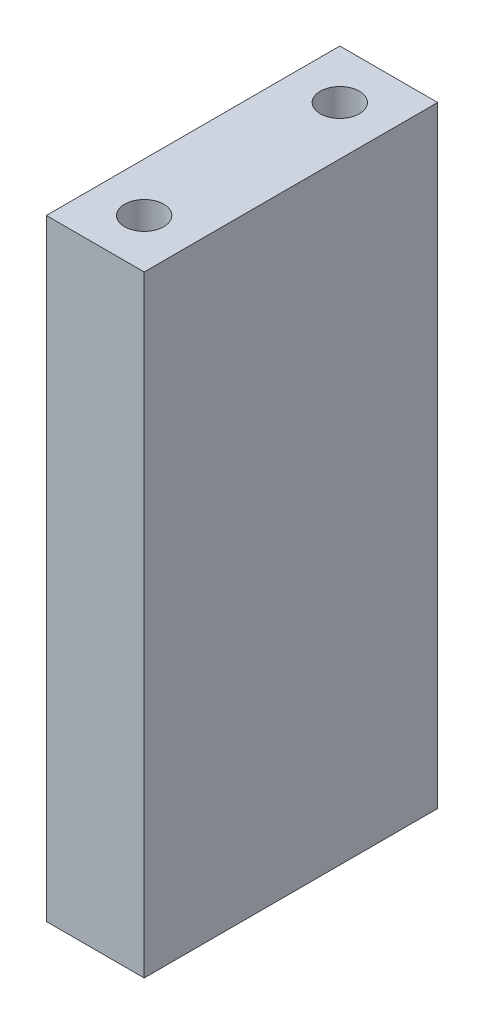
ISO-10303-21;
HEADER;
FILE_DESCRIPTION(('STEP AP214'),'2;1');
FILE_NAME('part.step','',(''),(''),'','','');
FILE_SCHEMA(('AUTOMOTIVE_DESIGN { 1 0 10303 214 1 1 1 1 }'));
ENDSEC;
DATA;
#1=APPLICATION_CONTEXT('core data for automotive mechanical design processes');
#2=APPLICATION_PROTOCOL_DEFINITION('international standard','automotive_design',2000,#1);
#3=PRODUCT_CONTEXT('',#1,'mechanical');
#4=PRODUCT('Part','Part','',(#3));
#5=PRODUCT_RELATED_PRODUCT_CATEGORY('part','',(#4));
#6=PRODUCT_DEFINITION_FORMATION('','',#4);
#7=PRODUCT_DEFINITION_CONTEXT('part definition',#1,'design');
#8=PRODUCT_DEFINITION('design','',#6,#7);
#9=PRODUCT_DEFINITION_SHAPE('','',#8);
#10=(LENGTH_UNIT() NAMED_UNIT(*) SI_UNIT(.MILLI.,.METRE.));
#11=(NAMED_UNIT(*) PLANE_ANGLE_UNIT() SI_UNIT($,.RADIAN.));
#12=(NAMED_UNIT(*) SI_UNIT($,.STERADIAN.) SOLID_ANGLE_UNIT());
#13=UNCERTAINTY_MEASURE_WITH_UNIT(LENGTH_MEASURE(1.E-05),#10,'distance_accuracy_value','');
#14=(GEOMETRIC_REPRESENTATION_CONTEXT(3) GLOBAL_UNCERTAINTY_ASSIGNED_CONTEXT((#13)) GLOBAL_UNIT_ASSIGNED_CONTEXT((#10,
#11,#12)) REPRESENTATION_CONTEXT('',''));
#15=CARTESIAN_POINT('',(0.,0.,0.));
#16=DIRECTION('',(0.,0.,1.));
#17=DIRECTION('',(1.,0.,0.));
#18=AXIS2_PLACEMENT_3D('',#15,#16,#17);
#19=CARTESIAN_POINT('',(20.,62.5,-30.));
#20=DIRECTION('',(0.,0.,1.));
#21=DIRECTION('',(0.,-1.,0.));
#22=AXIS2_PLACEMENT_3D('',#19,#20,#21);
#23=PLANE('',#22);
#24=DIRECTION('',(0.,1.,0.));
#25=VECTOR('',#24,1.);
#26=CARTESIAN_POINT('',(0.,62.5,-30.));
#27=LINE('',#26,#25);
#28=CARTESIAN_POINT('',(0.,-62.5,-30.));
#29=VERTEX_POINT('',#28);
#30=CARTESIAN_POINT('',(0.,62.5,-30.));
#31=VERTEX_POINT('',#30);
#32=EDGE_CURVE('E95',#29,#31,#27,.T.);
#33=ORIENTED_EDGE('',*,*,#32,.T.);
#34=DIRECTION('',(-1.,0.,0.));
#35=VECTOR('',#34,1.);
#36=CARTESIAN_POINT('',(20.,62.5,-30.));
#37=LINE('',#36,#35);
#38=CARTESIAN_POINT('',(20.,62.5,-30.));
#39=VERTEX_POINT('',#38);
#40=EDGE_CURVE('E11',#39,#31,#37,.T.);
#41=ORIENTED_EDGE('',*,*,#40,.F.);
#42=DIRECTION('',(0.,1.,0.));
#43=VECTOR('',#42,1.);
#44=CARTESIAN_POINT('',(20.,62.5,-30.));
#45=LINE('',#44,#43);
#46=CARTESIAN_POINT('',(20.,-62.5,-30.));
#47=VERTEX_POINT('',#46);
#48=EDGE_CURVE('E83',#47,#39,#45,.T.);
#49=ORIENTED_EDGE('',*,*,#48,.F.);
#50=DIRECTION('',(-1.,0.,0.));
#51=VECTOR('',#50,1.);
#52=CARTESIAN_POINT('',(20.,-62.5,-30.));
#53=LINE('',#52,#51);
#54=EDGE_CURVE('E91',#47,#29,#53,.T.);
#55=ORIENTED_EDGE('',*,*,#54,.T.);
#56=EDGE_LOOP('',(#33,#41,#49,#55));
#57=FACE_BOUND('',#56,.T.);
#58=ADVANCED_FACE('F32',(#57),#23,.F.);
#59=CARTESIAN_POINT('',(20.,62.5,30.));
#60=DIRECTION('',(0.,-1.,0.));
#61=DIRECTION('',(0.,0.,-1.));
#62=AXIS2_PLACEMENT_3D('',#59,#60,#61);
#63=PLANE('',#62);
#64=CARTESIAN_POINT('',(10.,62.5,20.));
#65=DIRECTION('',(0.,1.,0.));
#66=DIRECTION('',(0.,0.,1.));
#67=AXIS2_PLACEMENT_3D('',#64,#65,#66);
#68=CIRCLE('',#67,4.);
#69=CARTESIAN_POINT('',(10.,62.5,24.));
#70=VERTEX_POINT('',#69);
#71=EDGE_CURVE('E115',#70,#70,#68,.T.);
#72=ORIENTED_EDGE('',*,*,#71,.F.);
#73=EDGE_LOOP('',(#72));
#74=FACE_BOUND('',#73,.T.);
#75=CARTESIAN_POINT('',(10.,62.5,-20.));
#76=DIRECTION('',(0.,1.,0.));
#77=DIRECTION('',(0.,0.,1.));
#78=AXIS2_PLACEMENT_3D('',#75,#76,#77);
#79=CIRCLE('',#78,4.);
#80=CARTESIAN_POINT('',(10.,62.5,-16.));
#81=VERTEX_POINT('',#80);
#82=EDGE_CURVE('E109',#81,#81,#79,.T.);
#83=ORIENTED_EDGE('',*,*,#82,.F.);
#84=EDGE_LOOP('',(#83));
#85=FACE_BOUND('',#84,.T.);
#86=DIRECTION('',(0.,0.,1.));
#87=VECTOR('',#86,1.);
#88=CARTESIAN_POINT('',(0.,62.5,30.));
#89=LINE('',#88,#87);
#90=CARTESIAN_POINT('',(0.,62.5,30.));
#91=VERTEX_POINT('',#90);
#92=EDGE_CURVE('E87',#31,#91,#89,.T.);
#93=ORIENTED_EDGE('',*,*,#92,.T.);
#94=DIRECTION('',(-1.,0.,0.));
#95=VECTOR('',#94,1.);
#96=CARTESIAN_POINT('',(20.,62.5,30.));
#97=LINE('',#96,#95);
#98=CARTESIAN_POINT('',(20.,62.5,30.));
#99=VERTEX_POINT('',#98);
#100=EDGE_CURVE('E40',#99,#91,#97,.T.);
#101=ORIENTED_EDGE('',*,*,#100,.F.);
#102=DIRECTION('',(0.,0.,1.));
#103=VECTOR('',#102,1.);
#104=CARTESIAN_POINT('',(20.,62.5,30.));
#105=LINE('',#104,#103);
#106=EDGE_CURVE('E78',#39,#99,#105,.T.);
#107=ORIENTED_EDGE('',*,*,#106,.F.);
#108=ORIENTED_EDGE('',*,*,#40,.T.);
#109=EDGE_LOOP('',(#93,#101,#107,#108));
#110=FACE_BOUND('',#109,.T.);
#111=ADVANCED_FACE('F86',(#74,#85,#110),#63,.F.);
#112=CARTESIAN_POINT('',(20.,62.5,30.));
#113=DIRECTION('',(0.,0.,-1.));
#114=DIRECTION('',(0.,1.,0.));
#115=AXIS2_PLACEMENT_3D('',#112,#113,#114);
#116=PLANE('',#115);
#117=DIRECTION('',(0.,-1.,0.));
#118=VECTOR('',#117,1.);
#119=CARTESIAN_POINT('',(0.,62.5,30.));
#120=LINE('',#119,#118);
#121=CARTESIAN_POINT('',(0.,-62.5,30.));
#122=VERTEX_POINT('',#121);
#123=EDGE_CURVE('E65',#91,#122,#120,.T.);
#124=ORIENTED_EDGE('',*,*,#123,.T.);
#125=DIRECTION('',(-1.,0.,0.));
#126=VECTOR('',#125,1.);
#127=CARTESIAN_POINT('',(20.,-62.5,30.));
#128=LINE('',#127,#126);
#129=CARTESIAN_POINT('',(20.,-62.5,30.));
#130=VERTEX_POINT('',#129);
#131=EDGE_CURVE('E88',#130,#122,#128,.T.);
#132=ORIENTED_EDGE('',*,*,#131,.F.);
#133=DIRECTION('',(0.,-1.,0.));
#134=VECTOR('',#133,1.);
#135=CARTESIAN_POINT('',(20.,62.5,30.));
#136=LINE('',#135,#134);
#137=EDGE_CURVE('E81',#99,#130,#136,.T.);
#138=ORIENTED_EDGE('',*,*,#137,.F.);
#139=ORIENTED_EDGE('',*,*,#100,.T.);
#140=EDGE_LOOP('',(#124,#132,#138,#139));
#141=FACE_BOUND('',#140,.T.);
#142=ADVANCED_FACE('F89',(#141),#116,.F.);
#143=CARTESIAN_POINT('',(20.,-62.5,30.));
#144=DIRECTION('',(0.,1.,0.));
#145=DIRECTION('',(0.,0.,1.));
#146=AXIS2_PLACEMENT_3D('',#143,#144,#145);
#147=PLANE('',#146);
#148=CARTESIAN_POINT('',(10.,-62.5,-20.));
#149=DIRECTION('',(0.,-1.,0.));
#150=DIRECTION('',(0.,0.,-1.));
#151=AXIS2_PLACEMENT_3D('',#148,#149,#150);
#152=CIRCLE('',#151,4.);
#153=CARTESIAN_POINT('',(10.,-62.5,-24.));
#154=VERTEX_POINT('',#153);
#155=EDGE_CURVE('E127',#154,#154,#152,.T.);
#156=ORIENTED_EDGE('',*,*,#155,.F.);
#157=EDGE_LOOP('',(#156));
#158=FACE_BOUND('',#157,.T.);
#159=CARTESIAN_POINT('',(10.,-62.5,20.));
#160=DIRECTION('',(0.,-1.,0.));
#161=DIRECTION('',(0.,0.,-1.));
#162=AXIS2_PLACEMENT_3D('',#159,#160,#161);
#163=CIRCLE('',#162,4.);
#164=CARTESIAN_POINT('',(10.,-62.5,16.));
#165=VERTEX_POINT('',#164);
#166=EDGE_CURVE('E121',#165,#165,#163,.T.);
#167=ORIENTED_EDGE('',*,*,#166,.F.);
#168=EDGE_LOOP('',(#167));
#169=FACE_BOUND('',#168,.T.);
#170=DIRECTION('',(0.,0.,-1.));
#171=VECTOR('',#170,1.);
#172=CARTESIAN_POINT('',(0.,-62.5,30.));
#173=LINE('',#172,#171);
#174=EDGE_CURVE('E71',#122,#29,#173,.T.);
#175=ORIENTED_EDGE('',*,*,#174,.T.);
#176=ORIENTED_EDGE('',*,*,#54,.F.);
#177=DIRECTION('',(0.,0.,-1.));
#178=VECTOR('',#177,1.);
#179=CARTESIAN_POINT('',(20.,-62.5,30.));
#180=LINE('',#179,#178);
#181=EDGE_CURVE('E48',#130,#47,#180,.T.);
#182=ORIENTED_EDGE('',*,*,#181,.F.);
#183=ORIENTED_EDGE('',*,*,#131,.T.);
#184=EDGE_LOOP('',(#175,#176,#182,#183));
#185=FACE_BOUND('',#184,.T.);
#186=ADVANCED_FACE('F103',(#158,#169,#185),#147,.F.);
#187=CARTESIAN_POINT('',(20.,0.,0.));
#188=DIRECTION('',(1.,0.,0.));
#189=DIRECTION('',(0.,0.,-1.));
#190=AXIS2_PLACEMENT_3D('',#187,#188,#189);
#191=PLANE('',#190);
#192=ORIENTED_EDGE('',*,*,#48,.T.);
#193=ORIENTED_EDGE('',*,*,#106,.T.);
#194=ORIENTED_EDGE('',*,*,#137,.T.);
#195=ORIENTED_EDGE('',*,*,#181,.T.);
#196=EDGE_LOOP('',(#192,#193,#194,#195));
#197=FACE_BOUND('',#196,.T.);
#198=ADVANCED_FACE('F79',(#197),#191,.T.);
#199=CARTESIAN_POINT('',(0.,0.,0.));
#200=DIRECTION('',(1.,0.,0.));
#201=DIRECTION('',(0.,0.,-1.));
#202=AXIS2_PLACEMENT_3D('',#199,#200,#201);
#203=PLANE('',#202);
#204=ORIENTED_EDGE('',*,*,#32,.F.);
#205=ORIENTED_EDGE('',*,*,#174,.F.);
#206=ORIENTED_EDGE('',*,*,#123,.F.);
#207=ORIENTED_EDGE('',*,*,#92,.F.);
#208=EDGE_LOOP('',(#204,#205,#206,#207));
#209=FACE_BOUND('',#208,.T.);
#210=ADVANCED_FACE('F106',(#209),#203,.F.);
#211=CARTESIAN_POINT('',(10.,37.5,-20.));
#212=DIRECTION('',(0.,1.,0.));
#213=DIRECTION('',(0.,0.,1.));
#214=AXIS2_PLACEMENT_3D('',#211,#212,#213);
#215=CYLINDRICAL_SURFACE('',#214,4.);
#216=CARTESIAN_POINT('',(10.,37.5,-20.));
#217=DIRECTION('',(0.,1.,0.));
#218=DIRECTION('',(0.,0.,1.));
#219=AXIS2_PLACEMENT_3D('',#216,#217,#218);
#220=CIRCLE('',#219,4.);
#221=CARTESIAN_POINT('',(10.,37.5,-16.));
#222=VERTEX_POINT('',#221);
#223=EDGE_CURVE('E98',#222,#222,#220,.T.);
#224=ORIENTED_EDGE('',*,*,#223,.F.);
#225=EDGE_LOOP('',(#224));
#226=FACE_BOUND('',#225,.T.);
#227=ORIENTED_EDGE('',*,*,#82,.T.);
#228=EDGE_LOOP('',(#227));
#229=FACE_BOUND('',#228,.T.);
#230=ADVANCED_FACE('F176',(#226,#229),#215,.F.);
#231=CARTESIAN_POINT('',(10.,37.5,-20.));
#232=DIRECTION('',(0.,1.,0.));
#233=DIRECTION('',(0.,0.,1.));
#234=AXIS2_PLACEMENT_3D('',#231,#232,#233);
#235=PLANE('',#234);
#236=ORIENTED_EDGE('',*,*,#223,.T.);
#237=EDGE_LOOP('',(#236));
#238=FACE_BOUND('',#237,.T.);
#239=ADVANCED_FACE('F181',(#238),#235,.T.);
#240=CARTESIAN_POINT('',(10.,37.5,20.));
#241=DIRECTION('',(0.,1.,0.));
#242=DIRECTION('',(0.,0.,1.));
#243=AXIS2_PLACEMENT_3D('',#240,#241,#242);
#244=CYLINDRICAL_SURFACE('',#243,4.);
#245=CARTESIAN_POINT('',(10.,37.5,20.));
#246=DIRECTION('',(0.,1.,0.));
#247=DIRECTION('',(0.,0.,1.));
#248=AXIS2_PLACEMENT_3D('',#245,#246,#247);
#249=CIRCLE('',#248,4.);
#250=CARTESIAN_POINT('',(10.,37.5,24.));
#251=VERTEX_POINT('',#250);
#252=EDGE_CURVE('E112',#251,#251,#249,.T.);
#253=ORIENTED_EDGE('',*,*,#252,.F.);
#254=EDGE_LOOP('',(#253));
#255=FACE_BOUND('',#254,.T.);
#256=ORIENTED_EDGE('',*,*,#71,.T.);
#257=EDGE_LOOP('',(#256));
#258=FACE_BOUND('',#257,.T.);
#259=ADVANCED_FACE('F158',(#255,#258),#244,.F.);
#260=CARTESIAN_POINT('',(10.,37.5,20.));
#261=DIRECTION('',(0.,1.,0.));
#262=DIRECTION('',(0.,0.,1.));
#263=AXIS2_PLACEMENT_3D('',#260,#261,#262);
#264=PLANE('',#263);
#265=ORIENTED_EDGE('',*,*,#252,.T.);
#266=EDGE_LOOP('',(#265));
#267=FACE_BOUND('',#266,.T.);
#268=ADVANCED_FACE('F149',(#267),#264,.T.);
#269=CARTESIAN_POINT('',(10.,-37.5,20.));
#270=DIRECTION('',(0.,-1.,0.));
#271=DIRECTION('',(0.,0.,-1.));
#272=AXIS2_PLACEMENT_3D('',#269,#270,#271);
#273=CYLINDRICAL_SURFACE('',#272,4.);
#274=CARTESIAN_POINT('',(10.,-37.5,20.));
#275=DIRECTION('',(0.,-1.,0.));
#276=DIRECTION('',(0.,0.,-1.));
#277=AXIS2_PLACEMENT_3D('',#274,#275,#276);
#278=CIRCLE('',#277,4.);
#279=CARTESIAN_POINT('',(10.,-37.5,16.));
#280=VERTEX_POINT('',#279);
#281=EDGE_CURVE('E118',#280,#280,#278,.T.);
#282=ORIENTED_EDGE('',*,*,#281,.F.);
#283=EDGE_LOOP('',(#282));
#284=FACE_BOUND('',#283,.T.);
#285=ORIENTED_EDGE('',*,*,#166,.T.);
#286=EDGE_LOOP('',(#285));
#287=FACE_BOUND('',#286,.T.);
#288=ADVANCED_FACE('F147',(#284,#287),#273,.F.);
#289=CARTESIAN_POINT('',(10.,-37.5,20.));
#290=DIRECTION('',(0.,-1.,0.));
#291=DIRECTION('',(0.,0.,-1.));
#292=AXIS2_PLACEMENT_3D('',#289,#290,#291);
#293=PLANE('',#292);
#294=ORIENTED_EDGE('',*,*,#281,.T.);
#295=EDGE_LOOP('',(#294));
#296=FACE_BOUND('',#295,.T.);
#297=ADVANCED_FACE('F138',(#296),#293,.T.);
#298=CARTESIAN_POINT('',(10.,-37.5,-20.));
#299=DIRECTION('',(0.,-1.,0.));
#300=DIRECTION('',(0.,0.,-1.));
#301=AXIS2_PLACEMENT_3D('',#298,#299,#300);
#302=CYLINDRICAL_SURFACE('',#301,4.);
#303=CARTESIAN_POINT('',(10.,-37.5,-20.));
#304=DIRECTION('',(0.,-1.,0.));
#305=DIRECTION('',(0.,0.,-1.));
#306=AXIS2_PLACEMENT_3D('',#303,#304,#305);
#307=CIRCLE('',#306,4.);
#308=CARTESIAN_POINT('',(10.,-37.5,-24.));
#309=VERTEX_POINT('',#308);
#310=EDGE_CURVE('E124',#309,#309,#307,.T.);
#311=ORIENTED_EDGE('',*,*,#310,.F.);
#312=EDGE_LOOP('',(#311));
#313=FACE_BOUND('',#312,.T.);
#314=ORIENTED_EDGE('',*,*,#155,.T.);
#315=EDGE_LOOP('',(#314));
#316=FACE_BOUND('',#315,.T.);
#317=ADVANCED_FACE('F135',(#313,#316),#302,.F.);
#318=CARTESIAN_POINT('',(10.,-37.5,-20.));
#319=DIRECTION('',(0.,-1.,0.));
#320=DIRECTION('',(0.,0.,-1.));
#321=AXIS2_PLACEMENT_3D('',#318,#319,#320);
#322=PLANE('',#321);
#323=ORIENTED_EDGE('',*,*,#310,.T.);
#324=EDGE_LOOP('',(#323));
#325=FACE_BOUND('',#324,.T.);
#326=ADVANCED_FACE('F133',(#325),#322,.T.);
#327=CLOSED_SHELL('',(#58,#111,#142,#186,#198,#210,#230,#239,#259,#268,#288,#297,#317,#326));
#328=MANIFOLD_SOLID_BREP('B2',#327);
#329=ADVANCED_BREP_SHAPE_REPRESENTATION('',(#18,#328),#14);
#330=SHAPE_DEFINITION_REPRESENTATION(#9,#329);
ENDSEC;
END-ISO-10303-21;
